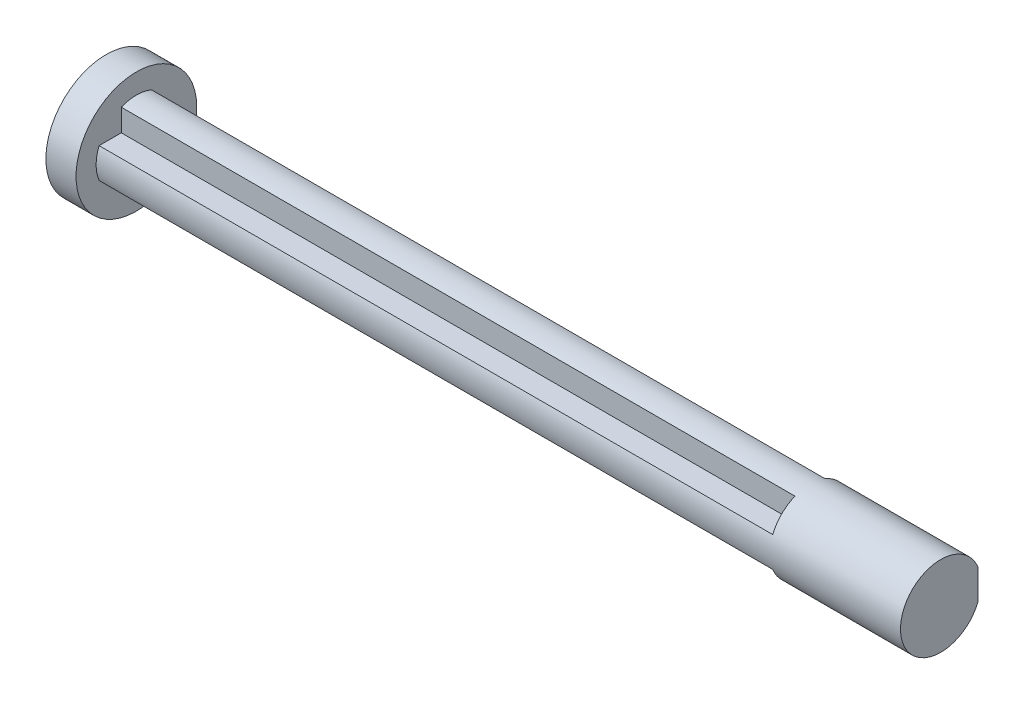
ISO-10303-21;
HEADER;
FILE_DESCRIPTION(('STEP AP214'),'2;1');
FILE_NAME('part.step','',(''),(''),'','','');
FILE_SCHEMA(('AUTOMOTIVE_DESIGN { 1 0 10303 214 1 1 1 1 }'));
ENDSEC;
DATA;
#1=APPLICATION_CONTEXT('core data for automotive mechanical design processes');
#2=APPLICATION_PROTOCOL_DEFINITION('international standard','automotive_design',2000,#1);
#3=PRODUCT_CONTEXT('',#1,'mechanical');
#4=PRODUCT('Part','Part','',(#3));
#5=PRODUCT_RELATED_PRODUCT_CATEGORY('part','',(#4));
#6=PRODUCT_DEFINITION_FORMATION('','',#4);
#7=PRODUCT_DEFINITION_CONTEXT('part definition',#1,'design');
#8=PRODUCT_DEFINITION('design','',#6,#7);
#9=PRODUCT_DEFINITION_SHAPE('','',#8);
#10=(LENGTH_UNIT() NAMED_UNIT(*) SI_UNIT(.MILLI.,.METRE.));
#11=(NAMED_UNIT(*) PLANE_ANGLE_UNIT() SI_UNIT($,.RADIAN.));
#12=(NAMED_UNIT(*) SI_UNIT($,.STERADIAN.) SOLID_ANGLE_UNIT());
#13=UNCERTAINTY_MEASURE_WITH_UNIT(LENGTH_MEASURE(1.E-05),#10,'distance_accuracy_value','');
#14=(GEOMETRIC_REPRESENTATION_CONTEXT(3) GLOBAL_UNCERTAINTY_ASSIGNED_CONTEXT((#13)) GLOBAL_UNIT_ASSIGNED_CONTEXT((#10,
#11,#12)) REPRESENTATION_CONTEXT('',''));
#15=CARTESIAN_POINT('',(0.,0.,0.));
#16=DIRECTION('',(0.,0.,1.));
#17=DIRECTION('',(1.,0.,0.));
#18=AXIS2_PLACEMENT_3D('',#15,#16,#17);
#19=CARTESIAN_POINT('',(80.,1.5,-3.70809924354783));
#20=DIRECTION('',(0.,0.,1.));
#21=DIRECTION('',(1.,0.,0.));
#22=AXIS2_PLACEMENT_3D('',#19,#20,#21);
#23=PLANE('',#22);
#24=CARTESIAN_POINT('',(75.,0.,-3.70809924354783));
#25=DIRECTION('',(0.,0.,-1.));
#26=DIRECTION('',(-1.,0.,0.));
#27=AXIS2_PLACEMENT_3D('',#24,#25,#26);
#28=CIRCLE('',#27,1.5);
#29=CARTESIAN_POINT('',(75.,1.5,-3.70809924354783));
#30=VERTEX_POINT('',#29);
#31=CARTESIAN_POINT('',(75.,-1.5,-3.70809924354783));
#32=VERTEX_POINT('',#31);
#33=EDGE_CURVE('E58',#30,#32,#28,.T.);
#34=ORIENTED_EDGE('',*,*,#33,.F.);
#35=DIRECTION('',(-1.,0.,0.));
#36=VECTOR('',#35,1.);
#37=CARTESIAN_POINT('',(80.,1.5,-3.70809924354783));
#38=LINE('',#37,#36);
#39=CARTESIAN_POINT('',(80.,1.5,-3.70809924354783));
#40=VERTEX_POINT('',#39);
#41=EDGE_CURVE('E161',#40,#30,#38,.T.);
#42=ORIENTED_EDGE('',*,*,#41,.F.);
#43=DIRECTION('',(0.,1.,0.));
#44=VECTOR('',#43,1.);
#45=CARTESIAN_POINT('',(80.,1.5,-3.70809924354783));
#46=LINE('',#45,#44);
#47=CARTESIAN_POINT('',(80.,-1.5,-3.70809924354783));
#48=VERTEX_POINT('',#47);
#49=EDGE_CURVE('E173',#48,#40,#46,.T.);
#50=ORIENTED_EDGE('',*,*,#49,.F.);
#51=DIRECTION('',(-1.,0.,0.));
#52=VECTOR('',#51,1.);
#53=CARTESIAN_POINT('',(80.,-1.5,-3.70809924354783));
#54=LINE('',#53,#52);
#55=EDGE_CURVE('E163',#48,#32,#54,.T.);
#56=ORIENTED_EDGE('',*,*,#55,.T.);
#57=EDGE_LOOP('',(#34,#42,#50,#56));
#58=FACE_BOUND('',#57,.T.);
#59=ADVANCED_FACE('F44',(#58),#23,.F.);
#60=CARTESIAN_POINT('',(69.,0.,0.));
#61=DIRECTION('',(1.,0.,0.));
#62=DIRECTION('',(0.,0.,-1.));
#63=AXIS2_PLACEMENT_3D('',#60,#61,#62);
#64=PLANE('',#63);
#65=DIRECTION('',(0.,1.,0.));
#66=VECTOR('',#65,1.);
#67=CARTESIAN_POINT('',(69.,1.5,-3.70809924354783));
#68=LINE('',#67,#66);
#69=CARTESIAN_POINT('',(69.,-1.5,-3.70809924354783));
#70=VERTEX_POINT('',#69);
#71=CARTESIAN_POINT('',(69.,1.5,-3.70809924354783));
#72=VERTEX_POINT('',#71);
#73=EDGE_CURVE('E166',#70,#72,#68,.T.);
#74=ORIENTED_EDGE('',*,*,#73,.F.);
#75=CARTESIAN_POINT('',(69.,0.,0.));
#76=DIRECTION('',(1.,0.,0.));
#77=DIRECTION('',(0.,0.,-1.));
#78=AXIS2_PLACEMENT_3D('',#75,#76,#77);
#79=CIRCLE('',#78,4.);
#80=EDGE_CURVE('E189',#70,#72,#79,.T.);
#81=ORIENTED_EDGE('',*,*,#80,.T.);
#82=EDGE_LOOP('',(#74,#81));
#83=FACE_BOUND('',#82,.T.);
#84=ADVANCED_FACE('F369',(#83),#64,.T.);
#85=CARTESIAN_POINT('',(67.,0.,1.5));
#86=DIRECTION('',(0.,0.,-1.));
#87=DIRECTION('',(-1.,0.,0.));
#88=AXIS2_PLACEMENT_3D('',#85,#86,#87);
#89=PLANE('',#88);
#90=DIRECTION('',(0.,-1.,0.));
#91=VECTOR('',#90,1.);
#92=CARTESIAN_POINT('',(0.,0.,1.5));
#93=LINE('',#92,#91);
#94=CARTESIAN_POINT('',(0.,3.70809924354783,1.5));
#95=VERTEX_POINT('',#94);
#96=CARTESIAN_POINT('',(0.,1.5,1.5));
#97=VERTEX_POINT('',#96);
#98=EDGE_CURVE('E234',#95,#97,#93,.T.);
#99=ORIENTED_EDGE('',*,*,#98,.T.);
#100=DIRECTION('',(-1.,0.,0.));
#101=VECTOR('',#100,1.);
#102=CARTESIAN_POINT('',(67.,1.5,1.5));
#103=LINE('',#102,#101);
#104=CARTESIAN_POINT('',(67.,1.5,1.5));
#105=VERTEX_POINT('',#104);
#106=EDGE_CURVE('E53',#105,#97,#103,.T.);
#107=ORIENTED_EDGE('',*,*,#106,.F.);
#108=DIRECTION('',(0.,-1.,0.));
#109=VECTOR('',#108,1.);
#110=CARTESIAN_POINT('',(67.,0.,1.5));
#111=LINE('',#110,#109);
#112=CARTESIAN_POINT('',(67.,3.70809924354783,1.5));
#113=VERTEX_POINT('',#112);
#114=EDGE_CURVE('E201',#113,#105,#111,.T.);
#115=ORIENTED_EDGE('',*,*,#114,.F.);
#116=DIRECTION('',(-1.,0.,0.));
#117=VECTOR('',#116,1.);
#118=CARTESIAN_POINT('',(67.,3.70809924354783,1.5));
#119=LINE('',#118,#117);
#120=EDGE_CURVE('E11',#113,#95,#119,.T.);
#121=ORIENTED_EDGE('',*,*,#120,.T.);
#122=EDGE_LOOP('',(#99,#107,#115,#121));
#123=FACE_BOUND('',#122,.T.);
#124=ADVANCED_FACE('F50',(#123),#89,.F.);
#125=CARTESIAN_POINT('',(67.,1.49999999999997,0.));
#126=DIRECTION('',(0.,1.,0.));
#127=DIRECTION('',(0.,0.,1.));
#128=AXIS2_PLACEMENT_3D('',#125,#126,#127);
#129=PLANE('',#128);
#130=DIRECTION('',(0.,0.,-1.));
#131=VECTOR('',#130,1.);
#132=CARTESIAN_POINT('',(0.,1.49999999999997,0.));
#133=LINE('',#132,#131);
#134=CARTESIAN_POINT('',(0.,1.50000000000004,3.70809924354782));
#135=VERTEX_POINT('',#134);
#136=EDGE_CURVE('E239',#135,#97,#133,.T.);
#137=ORIENTED_EDGE('',*,*,#136,.F.);
#138=DIRECTION('',(-1.,0.,0.));
#139=VECTOR('',#138,1.);
#140=CARTESIAN_POINT('',(67.,1.50000000000004,3.70809924354782));
#141=LINE('',#140,#139);
#142=CARTESIAN_POINT('',(67.,1.50000000000004,3.70809924354782));
#143=VERTEX_POINT('',#142);
#144=EDGE_CURVE('E308',#143,#135,#141,.T.);
#145=ORIENTED_EDGE('',*,*,#144,.F.);
#146=DIRECTION('',(0.,0.,-1.));
#147=VECTOR('',#146,1.);
#148=CARTESIAN_POINT('',(67.,1.49999999999997,0.));
#149=LINE('',#148,#147);
#150=EDGE_CURVE('E206',#143,#105,#149,.T.);
#151=ORIENTED_EDGE('',*,*,#150,.T.);
#152=ORIENTED_EDGE('',*,*,#106,.T.);
#153=EDGE_LOOP('',(#137,#145,#151,#152));
#154=FACE_BOUND('',#153,.T.);
#155=ADVANCED_FACE('F314',(#154),#129,.T.);
#156=CARTESIAN_POINT('',(67.,-1.50000000000002,0.));
#157=DIRECTION('',(0.,1.,0.));
#158=DIRECTION('',(0.,0.,1.));
#159=AXIS2_PLACEMENT_3D('',#156,#157,#158);
#160=PLANE('',#159);
#161=DIRECTION('',(0.,0.,-1.));
#162=VECTOR('',#161,1.);
#163=CARTESIAN_POINT('',(0.,-1.50000000000002,0.));
#164=LINE('',#163,#162);
#165=CARTESIAN_POINT('',(0.,-1.49999999999996,3.70809924354785));
#166=VERTEX_POINT('',#165);
#167=CARTESIAN_POINT('',(0.,-1.5,1.5));
#168=VERTEX_POINT('',#167);
#169=EDGE_CURVE('E242',#166,#168,#164,.T.);
#170=ORIENTED_EDGE('',*,*,#169,.T.);
#171=DIRECTION('',(-1.,0.,0.));
#172=VECTOR('',#171,1.);
#173=CARTESIAN_POINT('',(67.,-1.5,1.5));
#174=LINE('',#173,#172);
#175=CARTESIAN_POINT('',(67.,-1.5,1.5));
#176=VERTEX_POINT('',#175);
#177=EDGE_CURVE('E300',#176,#168,#174,.T.);
#178=ORIENTED_EDGE('',*,*,#177,.F.);
#179=DIRECTION('',(0.,0.,-1.));
#180=VECTOR('',#179,1.);
#181=CARTESIAN_POINT('',(67.,-1.50000000000002,0.));
#182=LINE('',#181,#180);
#183=CARTESIAN_POINT('',(67.,-1.49999999999996,3.70809924354785));
#184=VERTEX_POINT('',#183);
#185=EDGE_CURVE('E211',#184,#176,#182,.T.);
#186=ORIENTED_EDGE('',*,*,#185,.F.);
#187=DIRECTION('',(-1.,0.,0.));
#188=VECTOR('',#187,1.);
#189=CARTESIAN_POINT('',(67.,-1.49999999999996,3.70809924354785));
#190=LINE('',#189,#188);
#191=EDGE_CURVE('E305',#184,#166,#190,.T.);
#192=ORIENTED_EDGE('',*,*,#191,.T.);
#193=EDGE_LOOP('',(#170,#178,#186,#192));
#194=FACE_BOUND('',#193,.T.);
#195=ADVANCED_FACE('F546',(#194),#160,.F.);
#196=CARTESIAN_POINT('',(67.,0.,1.49999999999998));
#197=DIRECTION('',(0.,0.,1.));
#198=DIRECTION('',(0.,-1.,0.));
#199=AXIS2_PLACEMENT_3D('',#196,#197,#198);
#200=PLANE('',#199);
#201=DIRECTION('',(0.,1.,0.));
#202=VECTOR('',#201,1.);
#203=CARTESIAN_POINT('',(0.,0.,1.49999999999998));
#204=LINE('',#203,#202);
#205=CARTESIAN_POINT('',(0.,-3.70809924354782,1.50000000000003));
#206=VERTEX_POINT('',#205);
#207=EDGE_CURVE('E247',#206,#168,#204,.T.);
#208=ORIENTED_EDGE('',*,*,#207,.F.);
#209=DIRECTION('',(-1.,0.,0.));
#210=VECTOR('',#209,1.);
#211=CARTESIAN_POINT('',(67.,-3.70809924354782,1.50000000000003));
#212=LINE('',#211,#210);
#213=CARTESIAN_POINT('',(67.,-3.70809924354782,1.50000000000003));
#214=VERTEX_POINT('',#213);
#215=EDGE_CURVE('E294',#214,#206,#212,.T.);
#216=ORIENTED_EDGE('',*,*,#215,.F.);
#217=DIRECTION('',(0.,1.,0.));
#218=VECTOR('',#217,1.);
#219=CARTESIAN_POINT('',(67.,0.,1.49999999999998));
#220=LINE('',#219,#218);
#221=EDGE_CURVE('E212',#214,#176,#220,.T.);
#222=ORIENTED_EDGE('',*,*,#221,.T.);
#223=ORIENTED_EDGE('',*,*,#177,.T.);
#224=EDGE_LOOP('',(#208,#216,#222,#223));
#225=FACE_BOUND('',#224,.T.);
#226=ADVANCED_FACE('F540',(#225),#200,.T.);
#227=CARTESIAN_POINT('',(67.,0.,-1.50000000000001));
#228=DIRECTION('',(0.,0.,1.));
#229=DIRECTION('',(0.,-1.,0.));
#230=AXIS2_PLACEMENT_3D('',#227,#228,#229);
#231=PLANE('',#230);
#232=DIRECTION('',(0.,1.,0.));
#233=VECTOR('',#232,1.);
#234=CARTESIAN_POINT('',(0.,0.,-1.50000000000001));
#235=LINE('',#234,#233);
#236=CARTESIAN_POINT('',(0.,-3.70809924354784,-1.49999999999997));
#237=VERTEX_POINT('',#236);
#238=CARTESIAN_POINT('',(0.,-1.5,-1.5));
#239=VERTEX_POINT('',#238);
#240=EDGE_CURVE('E254',#237,#239,#235,.T.);
#241=ORIENTED_EDGE('',*,*,#240,.T.);
#242=DIRECTION('',(-1.,0.,0.));
#243=VECTOR('',#242,1.);
#244=CARTESIAN_POINT('',(67.,-1.5,-1.5));
#245=LINE('',#244,#243);
#246=CARTESIAN_POINT('',(67.,-1.5,-1.5));
#247=VERTEX_POINT('',#246);
#248=EDGE_CURVE('E288',#247,#239,#245,.T.);
#249=ORIENTED_EDGE('',*,*,#248,.F.);
#250=DIRECTION('',(0.,1.,0.));
#251=VECTOR('',#250,1.);
#252=CARTESIAN_POINT('',(67.,0.,-1.50000000000001));
#253=LINE('',#252,#251);
#254=CARTESIAN_POINT('',(67.,-3.70809924354784,-1.49999999999997));
#255=VERTEX_POINT('',#254);
#256=EDGE_CURVE('E217',#255,#247,#253,.T.);
#257=ORIENTED_EDGE('',*,*,#256,.F.);
#258=DIRECTION('',(-1.,0.,0.));
#259=VECTOR('',#258,1.);
#260=CARTESIAN_POINT('',(67.,-3.70809924354784,-1.49999999999997));
#261=LINE('',#260,#259);
#262=EDGE_CURVE('E289',#255,#237,#261,.T.);
#263=ORIENTED_EDGE('',*,*,#262,.T.);
#264=EDGE_LOOP('',(#241,#249,#257,#263));
#265=FACE_BOUND('',#264,.T.);
#266=ADVANCED_FACE('F531',(#265),#231,.F.);
#267=CARTESIAN_POINT('',(67.,-1.49999999999999,0.));
#268=DIRECTION('',(0.,-1.,0.));
#269=DIRECTION('',(0.,0.,-1.));
#270=AXIS2_PLACEMENT_3D('',#267,#268,#269);
#271=PLANE('',#270);
#272=DIRECTION('',(0.,0.,1.));
#273=VECTOR('',#272,1.);
#274=CARTESIAN_POINT('',(0.,-1.49999999999999,0.));
#275=LINE('',#274,#273);
#276=CARTESIAN_POINT('',(0.,-1.50000000000001,-3.70809924354783));
#277=VERTEX_POINT('',#276);
#278=EDGE_CURVE('E259',#277,#239,#275,.T.);
#279=ORIENTED_EDGE('',*,*,#278,.F.);
#280=DIRECTION('',(-1.,0.,0.));
#281=VECTOR('',#280,1.);
#282=CARTESIAN_POINT('',(67.,-1.50000000000001,-3.70809924354783));
#283=LINE('',#282,#281);
#284=CARTESIAN_POINT('',(67.,-1.50000000000001,-3.70809924354783));
#285=VERTEX_POINT('',#284);
#286=EDGE_CURVE('E281',#285,#277,#283,.T.);
#287=ORIENTED_EDGE('',*,*,#286,.F.);
#288=DIRECTION('',(0.,0.,1.));
#289=VECTOR('',#288,1.);
#290=CARTESIAN_POINT('',(67.,-1.49999999999999,0.));
#291=LINE('',#290,#289);
#292=EDGE_CURVE('E222',#285,#247,#291,.T.);
#293=ORIENTED_EDGE('',*,*,#292,.T.);
#294=ORIENTED_EDGE('',*,*,#248,.T.);
#295=EDGE_LOOP('',(#279,#287,#293,#294));
#296=FACE_BOUND('',#295,.T.);
#297=ADVANCED_FACE('F341',(#296),#271,.T.);
#298=CARTESIAN_POINT('',(67.,0.,0.));
#299=DIRECTION('',(-1.,0.,0.));
#300=DIRECTION('',(0.,0.,1.));
#301=AXIS2_PLACEMENT_3D('',#298,#299,#300);
#302=CYLINDRICAL_SURFACE('',#301,4.);
#303=CARTESIAN_POINT('',(0.,0.,0.));
#304=DIRECTION('',(1.,0.,0.));
#305=DIRECTION('',(0.,0.,-1.));
#306=AXIS2_PLACEMENT_3D('',#303,#304,#305);
#307=CIRCLE('',#306,4.);
#308=CARTESIAN_POINT('',(0.,1.49999999999999,-3.70809924354784));
#309=VERTEX_POINT('',#308);
#310=EDGE_CURVE('E265',#309,#277,#307,.F.);
#311=ORIENTED_EDGE('',*,*,#310,.F.);
#312=DIRECTION('',(-1.,0.,0.));
#313=VECTOR('',#312,1.);
#314=CARTESIAN_POINT('',(67.,1.49999999999999,-3.70809924354784));
#315=LINE('',#314,#313);
#316=CARTESIAN_POINT('',(67.,1.49999999999999,-3.70809924354784));
#317=VERTEX_POINT('',#316);
#318=EDGE_CURVE('E279',#317,#309,#315,.T.);
#319=ORIENTED_EDGE('',*,*,#318,.F.);
#320=CARTESIAN_POINT('',(67.,0.,0.));
#321=DIRECTION('',(1.,0.,0.));
#322=DIRECTION('',(0.,0.,-1.));
#323=AXIS2_PLACEMENT_3D('',#320,#321,#322);
#324=CIRCLE('',#323,4.);
#325=CARTESIAN_POINT('',(67.,3.70809924354783,-1.5));
#326=VERTEX_POINT('',#325);
#327=EDGE_CURVE('E187',#317,#326,#324,.T.);
#328=ORIENTED_EDGE('',*,*,#327,.T.);
#329=DIRECTION('',(-1.,0.,0.));
#330=VECTOR('',#329,1.);
#331=CARTESIAN_POINT('',(67.,3.70809924354783,-1.5));
#332=LINE('',#331,#330);
#333=CARTESIAN_POINT('',(0.,3.70809924354783,-1.5));
#334=VERTEX_POINT('',#333);
#335=EDGE_CURVE('E235',#326,#334,#332,.T.);
#336=ORIENTED_EDGE('',*,*,#335,.T.);
#337=CARTESIAN_POINT('',(0.,0.,0.));
#338=DIRECTION('',(1.,0.,0.));
#339=DIRECTION('',(0.,0.,-1.));
#340=AXIS2_PLACEMENT_3D('',#337,#338,#339);
#341=CIRCLE('',#340,4.);
#342=EDGE_CURVE('E200',#95,#334,#341,.F.);
#343=ORIENTED_EDGE('',*,*,#342,.F.);
#344=ORIENTED_EDGE('',*,*,#120,.F.);
#345=EDGE_CURVE('E192',#113,#143,#324,.T.);
#346=ORIENTED_EDGE('',*,*,#345,.T.);
#347=ORIENTED_EDGE('',*,*,#144,.T.);
#348=CARTESIAN_POINT('',(0.,0.,0.));
#349=DIRECTION('',(1.,0.,0.));
#350=DIRECTION('',(0.,0.,-1.));
#351=AXIS2_PLACEMENT_3D('',#348,#349,#350);
#352=CIRCLE('',#351,4.);
#353=EDGE_CURVE('E241',#166,#135,#352,.F.);
#354=ORIENTED_EDGE('',*,*,#353,.F.);
#355=ORIENTED_EDGE('',*,*,#191,.F.);
#356=EDGE_CURVE('E329',#184,#214,#324,.T.);
#357=ORIENTED_EDGE('',*,*,#356,.T.);
#358=ORIENTED_EDGE('',*,*,#215,.T.);
#359=CARTESIAN_POINT('',(0.,0.,0.));
#360=DIRECTION('',(1.,0.,0.));
#361=DIRECTION('',(0.,0.,-1.));
#362=AXIS2_PLACEMENT_3D('',#359,#360,#361);
#363=CIRCLE('',#362,4.);
#364=EDGE_CURVE('E252',#237,#206,#363,.F.);
#365=ORIENTED_EDGE('',*,*,#364,.F.);
#366=ORIENTED_EDGE('',*,*,#262,.F.);
#367=EDGE_CURVE('E183',#255,#285,#324,.T.);
#368=ORIENTED_EDGE('',*,*,#367,.T.);
#369=ORIENTED_EDGE('',*,*,#286,.T.);
#370=EDGE_LOOP('',(#311,#319,#328,#336,#343,#344,#346,#347,#354,#355,#357,#358,#365,#366,#368,#369));
#371=FACE_BOUND('',#370,.T.);
#372=ORIENTED_EDGE('',*,*,#55,.F.);
#373=CARTESIAN_POINT('',(80.,0.,0.));
#374=DIRECTION('',(1.,0.,0.));
#375=DIRECTION('',(0.,0.,1.));
#376=AXIS2_PLACEMENT_3D('',#373,#374,#375);
#377=CIRCLE('',#376,4.);
#378=EDGE_CURVE('E180',#40,#48,#377,.T.);
#379=ORIENTED_EDGE('',*,*,#378,.F.);
#380=ORIENTED_EDGE('',*,*,#41,.T.);
#381=EDGE_CURVE('E170',#30,#72,#38,.T.);
#382=ORIENTED_EDGE('',*,*,#381,.T.);
#383=ORIENTED_EDGE('',*,*,#80,.F.);
#384=EDGE_CURVE('E70',#32,#70,#54,.T.);
#385=ORIENTED_EDGE('',*,*,#384,.F.);
#386=EDGE_LOOP('',(#372,#379,#380,#382,#383,#385));
#387=FACE_BOUND('',#386,.T.);
#388=ADVANCED_FACE('F178',(#371,#387),#302,.T.);
#389=CARTESIAN_POINT('',(67.,1.5,0.));
#390=DIRECTION('',(0.,-1.,0.));
#391=DIRECTION('',(0.,0.,-1.));
#392=AXIS2_PLACEMENT_3D('',#389,#390,#391);
#393=PLANE('',#392);
#394=DIRECTION('',(0.,0.,1.));
#395=VECTOR('',#394,1.);
#396=CARTESIAN_POINT('',(0.,1.5,0.));
#397=LINE('',#396,#395);
#398=CARTESIAN_POINT('',(0.,1.5,-1.5));
#399=VERTEX_POINT('',#398);
#400=EDGE_CURVE('E264',#309,#399,#397,.T.);
#401=ORIENTED_EDGE('',*,*,#400,.T.);
#402=DIRECTION('',(-1.,0.,0.));
#403=VECTOR('',#402,1.);
#404=CARTESIAN_POINT('',(67.,1.5,-1.5));
#405=LINE('',#404,#403);
#406=CARTESIAN_POINT('',(67.,1.5,-1.5));
#407=VERTEX_POINT('',#406);
#408=EDGE_CURVE('E273',#407,#399,#405,.T.);
#409=ORIENTED_EDGE('',*,*,#408,.F.);
#410=DIRECTION('',(0.,0.,1.));
#411=VECTOR('',#410,1.);
#412=CARTESIAN_POINT('',(67.,1.5,0.));
#413=LINE('',#412,#411);
#414=EDGE_CURVE('E223',#317,#407,#413,.T.);
#415=ORIENTED_EDGE('',*,*,#414,.F.);
#416=ORIENTED_EDGE('',*,*,#318,.T.);
#417=EDGE_LOOP('',(#401,#409,#415,#416));
#418=FACE_BOUND('',#417,.T.);
#419=ADVANCED_FACE('F348',(#418),#393,.F.);
#420=CARTESIAN_POINT('',(67.,0.,-1.5));
#421=DIRECTION('',(0.,0.,-1.));
#422=DIRECTION('',(-1.,0.,0.));
#423=AXIS2_PLACEMENT_3D('',#420,#421,#422);
#424=PLANE('',#423);
#425=DIRECTION('',(0.,-1.,0.));
#426=VECTOR('',#425,1.);
#427=CARTESIAN_POINT('',(0.,0.,-1.5));
#428=LINE('',#427,#426);
#429=EDGE_CURVE('E210',#334,#399,#428,.T.);
#430=ORIENTED_EDGE('',*,*,#429,.F.);
#431=ORIENTED_EDGE('',*,*,#335,.F.);
#432=DIRECTION('',(0.,-1.,0.));
#433=VECTOR('',#432,1.);
#434=CARTESIAN_POINT('',(67.,0.,-1.5));
#435=LINE('',#434,#433);
#436=EDGE_CURVE('E230',#326,#407,#435,.T.);
#437=ORIENTED_EDGE('',*,*,#436,.T.);
#438=ORIENTED_EDGE('',*,*,#408,.T.);
#439=EDGE_LOOP('',(#430,#431,#437,#438));
#440=FACE_BOUND('',#439,.T.);
#441=ADVANCED_FACE('F352',(#440),#424,.T.);
#442=CARTESIAN_POINT('',(-3.,0.,0.));
#443=DIRECTION('',(1.,0.,0.));
#444=DIRECTION('',(0.,0.,-1.));
#445=AXIS2_PLACEMENT_3D('',#442,#443,#444);
#446=CYLINDRICAL_SURFACE('',#445,6.);
#447=CARTESIAN_POINT('',(-3.,0.,0.));
#448=DIRECTION('',(1.,0.,0.));
#449=DIRECTION('',(0.,0.,-1.));
#450=AXIS2_PLACEMENT_3D('',#447,#448,#449);
#451=CIRCLE('',#450,6.);
#452=CARTESIAN_POINT('',(-3.,0.,-6.));
#453=VERTEX_POINT('',#452);
#454=EDGE_CURVE('E194',#453,#453,#451,.T.);
#455=ORIENTED_EDGE('',*,*,#454,.T.);
#456=EDGE_LOOP('',(#455));
#457=FACE_BOUND('',#456,.T.);
#458=CARTESIAN_POINT('',(0.,0.,0.));
#459=DIRECTION('',(1.,0.,0.));
#460=DIRECTION('',(0.,0.,-1.));
#461=AXIS2_PLACEMENT_3D('',#458,#459,#460);
#462=CIRCLE('',#461,6.);
#463=CARTESIAN_POINT('',(0.,0.,-6.));
#464=VERTEX_POINT('',#463);
#465=EDGE_CURVE('E188',#464,#464,#462,.T.);
#466=ORIENTED_EDGE('',*,*,#465,.F.);
#467=EDGE_LOOP('',(#466));
#468=FACE_BOUND('',#467,.T.);
#469=ADVANCED_FACE('F360',(#457,#468),#446,.T.);
#470=CARTESIAN_POINT('',(-3.,0.,0.));
#471=DIRECTION('',(1.,0.,0.));
#472=DIRECTION('',(0.,0.,-1.));
#473=AXIS2_PLACEMENT_3D('',#470,#471,#472);
#474=PLANE('',#473);
#475=ORIENTED_EDGE('',*,*,#454,.F.);
#476=EDGE_LOOP('',(#475));
#477=FACE_BOUND('',#476,.T.);
#478=ADVANCED_FACE('F365',(#477),#474,.F.);
#479=CARTESIAN_POINT('',(0.,0.,0.));
#480=DIRECTION('',(1.,0.,0.));
#481=DIRECTION('',(0.,0.,-1.));
#482=AXIS2_PLACEMENT_3D('',#479,#480,#481);
#483=PLANE('',#482);
#484=ORIENTED_EDGE('',*,*,#98,.F.);
#485=ORIENTED_EDGE('',*,*,#342,.T.);
#486=ORIENTED_EDGE('',*,*,#429,.T.);
#487=ORIENTED_EDGE('',*,*,#400,.F.);
#488=ORIENTED_EDGE('',*,*,#310,.T.);
#489=ORIENTED_EDGE('',*,*,#278,.T.);
#490=ORIENTED_EDGE('',*,*,#240,.F.);
#491=ORIENTED_EDGE('',*,*,#364,.T.);
#492=ORIENTED_EDGE('',*,*,#207,.T.);
#493=ORIENTED_EDGE('',*,*,#169,.F.);
#494=ORIENTED_EDGE('',*,*,#353,.T.);
#495=ORIENTED_EDGE('',*,*,#136,.T.);
#496=EDGE_LOOP('',(#484,#485,#486,#487,#488,#489,#490,#491,#492,#493,#494,#495));
#497=FACE_BOUND('',#496,.T.);
#498=ORIENTED_EDGE('',*,*,#465,.T.);
#499=EDGE_LOOP('',(#498));
#500=FACE_BOUND('',#499,.T.);
#501=ADVANCED_FACE('F321',(#497,#500),#483,.T.);
#502=CARTESIAN_POINT('',(67.,0.,0.));
#503=DIRECTION('',(1.,0.,0.));
#504=DIRECTION('',(0.,0.,-1.));
#505=AXIS2_PLACEMENT_3D('',#502,#503,#504);
#506=PLANE('',#505);
#507=ORIENTED_EDGE('',*,*,#345,.F.);
#508=ORIENTED_EDGE('',*,*,#114,.T.);
#509=ORIENTED_EDGE('',*,*,#150,.F.);
#510=EDGE_LOOP('',(#507,#508,#509));
#511=FACE_BOUND('',#510,.T.);
#512=ADVANCED_FACE('F390',(#511),#506,.F.);
#513=ORIENTED_EDGE('',*,*,#356,.F.);
#514=ORIENTED_EDGE('',*,*,#185,.T.);
#515=ORIENTED_EDGE('',*,*,#221,.F.);
#516=EDGE_LOOP('',(#513,#514,#515));
#517=FACE_BOUND('',#516,.T.);
#518=ADVANCED_FACE('F394',(#517),#506,.F.);
#519=ORIENTED_EDGE('',*,*,#367,.F.);
#520=ORIENTED_EDGE('',*,*,#256,.T.);
#521=ORIENTED_EDGE('',*,*,#292,.F.);
#522=EDGE_LOOP('',(#519,#520,#521));
#523=FACE_BOUND('',#522,.T.);
#524=ADVANCED_FACE('F384',(#523),#506,.F.);
#525=ORIENTED_EDGE('',*,*,#327,.F.);
#526=ORIENTED_EDGE('',*,*,#414,.T.);
#527=ORIENTED_EDGE('',*,*,#436,.F.);
#528=EDGE_LOOP('',(#525,#526,#527));
#529=FACE_BOUND('',#528,.T.);
#530=ADVANCED_FACE('F351',(#529),#506,.F.);
#531=EDGE_CURVE('E151',#32,#30,#28,.T.);
#532=ORIENTED_EDGE('',*,*,#531,.F.);
#533=ORIENTED_EDGE('',*,*,#384,.T.);
#534=ORIENTED_EDGE('',*,*,#73,.T.);
#535=ORIENTED_EDGE('',*,*,#381,.F.);
#536=EDGE_LOOP('',(#532,#533,#534,#535));
#537=FACE_BOUND('',#536,.T.);
#538=ADVANCED_FACE('F169',(#537),#23,.F.);
#539=CARTESIAN_POINT('',(80.,0.,0.));
#540=DIRECTION('',(-1.,0.,0.));
#541=DIRECTION('',(0.,0.,1.));
#542=AXIS2_PLACEMENT_3D('',#539,#540,#541);
#543=PLANE('',#542);
#544=ORIENTED_EDGE('',*,*,#378,.T.);
#545=ORIENTED_EDGE('',*,*,#49,.T.);
#546=EDGE_LOOP('',(#544,#545));
#547=FACE_BOUND('',#546,.T.);
#548=ADVANCED_FACE('F378',(#547),#543,.F.);
#549=CARTESIAN_POINT('',(75.,0.,0.291900756452169));
#550=DIRECTION('',(0.,0.,-1.));
#551=DIRECTION('',(-1.,0.,0.));
#552=AXIS2_PLACEMENT_3D('',#549,#550,#551);
#553=CYLINDRICAL_SURFACE('',#552,1.5);
#554=CARTESIAN_POINT('',(75.,0.,0.291900756452169));
#555=DIRECTION('',(0.,0.,-1.));
#556=DIRECTION('',(-1.,0.,0.));
#557=AXIS2_PLACEMENT_3D('',#554,#555,#556);
#558=CIRCLE('',#557,1.5);
#559=CARTESIAN_POINT('',(73.5,0.,0.291900756452169));
#560=VERTEX_POINT('',#559);
#561=EDGE_CURVE('E167',#560,#560,#558,.T.);
#562=ORIENTED_EDGE('',*,*,#561,.F.);
#563=EDGE_LOOP('',(#562));
#564=FACE_BOUND('',#563,.T.);
#565=ORIENTED_EDGE('',*,*,#33,.T.);
#566=ORIENTED_EDGE('',*,*,#531,.T.);
#567=EDGE_LOOP('',(#565,#566));
#568=FACE_BOUND('',#567,.T.);
#569=ADVANCED_FACE('F155',(#564,#568),#553,.F.);
#570=CARTESIAN_POINT('',(75.,0.,0.291900756452169));
#571=DIRECTION('',(0.,0.,-1.));
#572=DIRECTION('',(-1.,0.,0.));
#573=AXIS2_PLACEMENT_3D('',#570,#571,#572);
#574=PLANE('',#573);
#575=ORIENTED_EDGE('',*,*,#561,.T.);
#576=EDGE_LOOP('',(#575));
#577=FACE_BOUND('',#576,.T.);
#578=ADVANCED_FACE('F478',(#577),#574,.T.);
#579=CLOSED_SHELL('',(#59,#84,#124,#155,#195,#226,#266,#297,#388,#419,#441,#469,#478,#501,#512,
#518,#524,#530,#538,#548,#569,#578));
#580=MANIFOLD_SOLID_BREP('B2',#579);
#581=ADVANCED_BREP_SHAPE_REPRESENTATION('',(#18,#580),#14);
#582=SHAPE_DEFINITION_REPRESENTATION(#9,#581);
ENDSEC;
END-ISO-10303-21;
